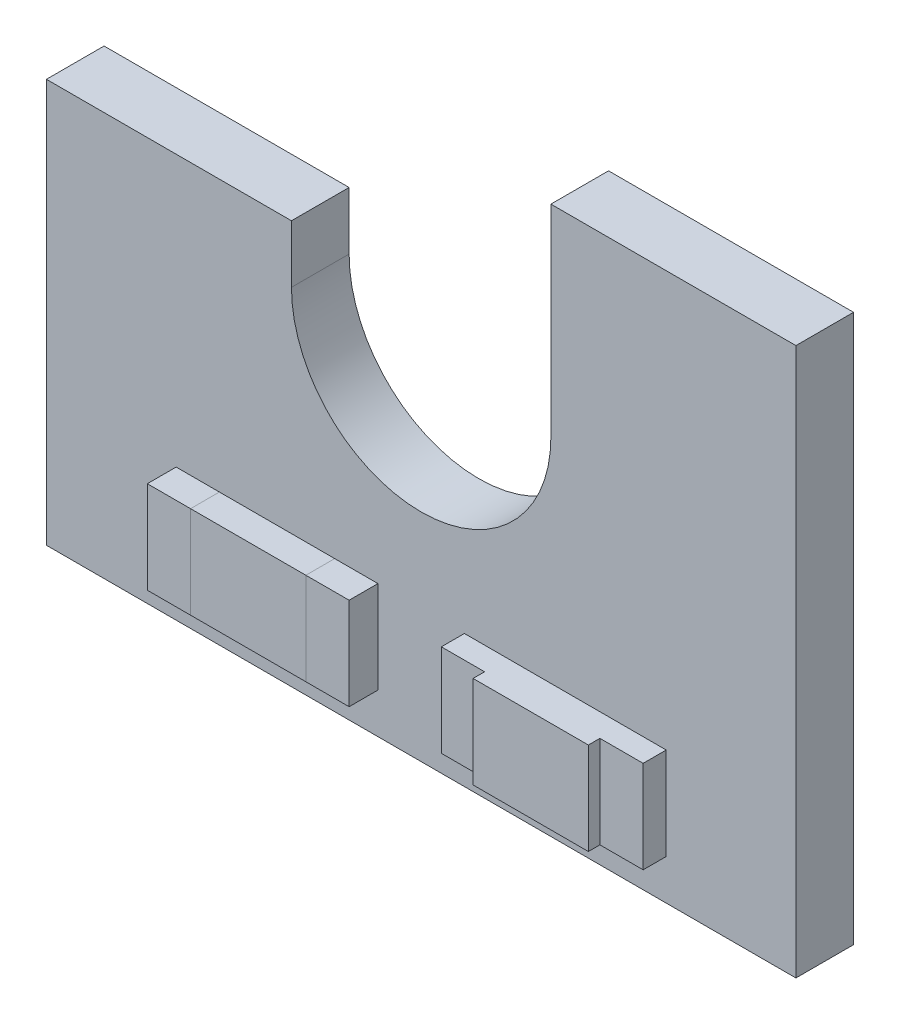
ISO-10303-21;
HEADER;
FILE_DESCRIPTION(('STEP AP214'),'2;1');
FILE_NAME('part.step','',(''),(''),'','','');
FILE_SCHEMA(('AUTOMOTIVE_DESIGN { 1 0 10303 214 1 1 1 1 }'));
ENDSEC;
DATA;
#1=APPLICATION_CONTEXT('core data for automotive mechanical design processes');
#2=APPLICATION_PROTOCOL_DEFINITION('international standard','automotive_design',2000,#1);
#3=PRODUCT_CONTEXT('',#1,'mechanical');
#4=PRODUCT('Part','Part','',(#3));
#5=PRODUCT_RELATED_PRODUCT_CATEGORY('part','',(#4));
#6=PRODUCT_DEFINITION_FORMATION('','',#4);
#7=PRODUCT_DEFINITION_CONTEXT('part definition',#1,'design');
#8=PRODUCT_DEFINITION('design','',#6,#7);
#9=PRODUCT_DEFINITION_SHAPE('','',#8);
#10=(LENGTH_UNIT() NAMED_UNIT(*) SI_UNIT(.MILLI.,.METRE.));
#11=(NAMED_UNIT(*) PLANE_ANGLE_UNIT() SI_UNIT($,.RADIAN.));
#12=(NAMED_UNIT(*) SI_UNIT($,.STERADIAN.) SOLID_ANGLE_UNIT());
#13=UNCERTAINTY_MEASURE_WITH_UNIT(LENGTH_MEASURE(1.E-05),#10,'distance_accuracy_value','');
#14=(GEOMETRIC_REPRESENTATION_CONTEXT(3) GLOBAL_UNCERTAINTY_ASSIGNED_CONTEXT((#13)) GLOBAL_UNIT_ASSIGNED_CONTEXT((#10,
#11,#12)) REPRESENTATION_CONTEXT('',''));
#15=CARTESIAN_POINT('',(0.,0.,0.));
#16=DIRECTION('',(0.,0.,1.));
#17=DIRECTION('',(1.,0.,0.));
#18=AXIS2_PLACEMENT_3D('',#15,#16,#17);
#19=CARTESIAN_POINT('',(0.,0.,0.4));
#20=DIRECTION('',(0.,0.,1.));
#21=DIRECTION('',(1.,0.,0.));
#22=AXIS2_PLACEMENT_3D('',#19,#20,#21);
#23=PLANE('',#22);
#24=DIRECTION('',(0.,1.,0.));
#25=VECTOR('',#24,1.);
#26=CARTESIAN_POINT('',(3.5,-2.45,0.4));
#27=LINE('',#26,#25);
#28=CARTESIAN_POINT('',(3.5,-4.05,0.4));
#29=VERTEX_POINT('',#28);
#30=CARTESIAN_POINT('',(3.5,-2.45,0.4));
#31=VERTEX_POINT('',#30);
#32=EDGE_CURVE('E59',#29,#31,#27,.T.);
#33=ORIENTED_EDGE('',*,*,#32,.F.);
#34=DIRECTION('',(1.,0.,0.));
#35=VECTOR('',#34,1.);
#36=CARTESIAN_POINT('',(0.750000000000001,-4.05,0.4));
#37=LINE('',#36,#35);
#38=CARTESIAN_POINT('',(4.25,-4.05,0.4));
#39=VERTEX_POINT('',#38);
#40=EDGE_CURVE('E148',#29,#39,#37,.T.);
#41=ORIENTED_EDGE('',*,*,#40,.T.);
#42=DIRECTION('',(0.,1.,0.));
#43=VECTOR('',#42,1.);
#44=CARTESIAN_POINT('',(4.25,-2.45,0.4));
#45=LINE('',#44,#43);
#46=CARTESIAN_POINT('',(4.25,-2.45,0.4));
#47=VERTEX_POINT('',#46);
#48=EDGE_CURVE('E139',#39,#47,#45,.T.);
#49=ORIENTED_EDGE('',*,*,#48,.T.);
#50=DIRECTION('',(-1.,0.,0.));
#51=VECTOR('',#50,1.);
#52=CARTESIAN_POINT('',(0.750000000000001,-2.45,0.4));
#53=LINE('',#52,#51);
#54=EDGE_CURVE('E144',#47,#31,#53,.T.);
#55=ORIENTED_EDGE('',*,*,#54,.T.);
#56=EDGE_LOOP('',(#33,#41,#49,#55));
#57=FACE_BOUND('',#56,.T.);
#58=ADVANCED_FACE('F44',(#57),#23,.T.);
#59=CARTESIAN_POINT('',(4.25,-2.45,0.4));
#60=DIRECTION('',(-1.,0.,0.));
#61=DIRECTION('',(0.,0.,1.));
#62=AXIS2_PLACEMENT_3D('',#59,#60,#61);
#63=PLANE('',#62);
#64=DIRECTION('',(0.,1.,0.));
#65=VECTOR('',#64,1.);
#66=CARTESIAN_POINT('',(4.25,-2.45,0.));
#67=LINE('',#66,#65);
#68=CARTESIAN_POINT('',(4.25,-4.05,0.));
#69=VERTEX_POINT('',#68);
#70=CARTESIAN_POINT('',(4.25,-2.45,0.));
#71=VERTEX_POINT('',#70);
#72=EDGE_CURVE('E130',#69,#71,#67,.T.);
#73=ORIENTED_EDGE('',*,*,#72,.T.);
#74=DIRECTION('',(0.,0.,-1.));
#75=VECTOR('',#74,1.);
#76=CARTESIAN_POINT('',(4.25,-2.45,0.4));
#77=LINE('',#76,#75);
#78=EDGE_CURVE('E12',#47,#71,#77,.T.);
#79=ORIENTED_EDGE('',*,*,#78,.F.);
#80=ORIENTED_EDGE('',*,*,#48,.F.);
#81=DIRECTION('',(0.,0.,-1.));
#82=VECTOR('',#81,1.);
#83=CARTESIAN_POINT('',(4.25,-4.05,0.4));
#84=LINE('',#83,#82);
#85=EDGE_CURVE('E150',#39,#69,#84,.T.);
#86=ORIENTED_EDGE('',*,*,#85,.T.);
#87=EDGE_LOOP('',(#73,#79,#80,#86));
#88=FACE_BOUND('',#87,.T.);
#89=ADVANCED_FACE('F46',(#88),#63,.F.);
#90=CARTESIAN_POINT('',(0.750000000000001,-2.45,0.4));
#91=DIRECTION('',(0.,-1.,0.));
#92=DIRECTION('',(0.,0.,-1.));
#93=AXIS2_PLACEMENT_3D('',#90,#91,#92);
#94=PLANE('',#93);
#95=DIRECTION('',(-1.,0.,0.));
#96=VECTOR('',#95,1.);
#97=CARTESIAN_POINT('',(0.750000000000001,-2.45,0.));
#98=LINE('',#97,#96);
#99=CARTESIAN_POINT('',(0.750000000000001,-2.45,0.));
#100=VERTEX_POINT('',#99);
#101=EDGE_CURVE('E133',#71,#100,#98,.T.);
#102=ORIENTED_EDGE('',*,*,#101,.T.);
#103=DIRECTION('',(0.,0.,-1.));
#104=VECTOR('',#103,1.);
#105=CARTESIAN_POINT('',(0.750000000000001,-2.45,0.4));
#106=LINE('',#105,#104);
#107=CARTESIAN_POINT('',(0.750000000000001,-2.45,0.4));
#108=VERTEX_POINT('',#107);
#109=EDGE_CURVE('E52',#108,#100,#106,.T.);
#110=ORIENTED_EDGE('',*,*,#109,.F.);
#111=CARTESIAN_POINT('',(1.5,-2.45,0.4));
#112=VERTEX_POINT('',#111);
#113=EDGE_CURVE('E142',#112,#108,#53,.T.);
#114=ORIENTED_EDGE('',*,*,#113,.F.);
#115=DIRECTION('',(0.,0.,-1.));
#116=VECTOR('',#115,1.);
#117=CARTESIAN_POINT('',(1.5,-2.45,0.6));
#118=LINE('',#117,#116);
#119=CARTESIAN_POINT('',(1.5,-2.45,0.6));
#120=VERTEX_POINT('',#119);
#121=EDGE_CURVE('E115',#120,#112,#118,.T.);
#122=ORIENTED_EDGE('',*,*,#121,.F.);
#123=DIRECTION('',(-1.,0.,0.));
#124=VECTOR('',#123,1.);
#125=CARTESIAN_POINT('',(1.5,-2.45,0.6));
#126=LINE('',#125,#124);
#127=CARTESIAN_POINT('',(3.5,-2.45,0.6));
#128=VERTEX_POINT('',#127);
#129=EDGE_CURVE('E109',#128,#120,#126,.T.);
#130=ORIENTED_EDGE('',*,*,#129,.F.);
#131=DIRECTION('',(0.,0.,-1.));
#132=VECTOR('',#131,1.);
#133=CARTESIAN_POINT('',(3.5,-2.45,0.6));
#134=LINE('',#133,#132);
#135=EDGE_CURVE('E113',#128,#31,#134,.T.);
#136=ORIENTED_EDGE('',*,*,#135,.T.);
#137=ORIENTED_EDGE('',*,*,#54,.F.);
#138=ORIENTED_EDGE('',*,*,#78,.T.);
#139=EDGE_LOOP('',(#102,#110,#114,#122,#130,#136,#137,#138));
#140=FACE_BOUND('',#139,.T.);
#141=ADVANCED_FACE('F111',(#140),#94,.F.);
#142=CARTESIAN_POINT('',(0.750000000000001,-2.45,0.4));
#143=DIRECTION('',(1.,0.,0.));
#144=DIRECTION('',(0.,1.,0.));
#145=AXIS2_PLACEMENT_3D('',#142,#143,#144);
#146=PLANE('',#145);
#147=DIRECTION('',(0.,-1.,0.));
#148=VECTOR('',#147,1.);
#149=CARTESIAN_POINT('',(0.750000000000001,-2.45,0.));
#150=LINE('',#149,#148);
#151=CARTESIAN_POINT('',(0.750000000000001,-4.05,0.));
#152=VERTEX_POINT('',#151);
#153=EDGE_CURVE('E153',#100,#152,#150,.T.);
#154=ORIENTED_EDGE('',*,*,#153,.T.);
#155=DIRECTION('',(0.,0.,-1.));
#156=VECTOR('',#155,1.);
#157=CARTESIAN_POINT('',(0.750000000000001,-4.05,0.4));
#158=LINE('',#157,#156);
#159=CARTESIAN_POINT('',(0.750000000000001,-4.05,0.4));
#160=VERTEX_POINT('',#159);
#161=EDGE_CURVE('E158',#160,#152,#158,.T.);
#162=ORIENTED_EDGE('',*,*,#161,.F.);
#163=DIRECTION('',(0.,-1.,0.));
#164=VECTOR('',#163,1.);
#165=CARTESIAN_POINT('',(0.750000000000001,-2.45,0.4));
#166=LINE('',#165,#164);
#167=EDGE_CURVE('E146',#108,#160,#166,.T.);
#168=ORIENTED_EDGE('',*,*,#167,.F.);
#169=ORIENTED_EDGE('',*,*,#109,.T.);
#170=EDGE_LOOP('',(#154,#162,#168,#169));
#171=FACE_BOUND('',#170,.T.);
#172=ADVANCED_FACE('F165',(#171),#146,.F.);
#173=CARTESIAN_POINT('',(0.750000000000001,-4.05,0.4));
#174=DIRECTION('',(0.,1.,0.));
#175=DIRECTION('',(0.,0.,1.));
#176=AXIS2_PLACEMENT_3D('',#173,#174,#175);
#177=PLANE('',#176);
#178=DIRECTION('',(1.,0.,0.));
#179=VECTOR('',#178,1.);
#180=CARTESIAN_POINT('',(0.750000000000001,-4.05,0.));
#181=LINE('',#180,#179);
#182=EDGE_CURVE('E143',#152,#69,#181,.T.);
#183=ORIENTED_EDGE('',*,*,#182,.T.);
#184=ORIENTED_EDGE('',*,*,#85,.F.);
#185=ORIENTED_EDGE('',*,*,#40,.F.);
#186=DIRECTION('',(0.,0.,-1.));
#187=VECTOR('',#186,1.);
#188=CARTESIAN_POINT('',(3.5,-4.05,0.6));
#189=LINE('',#188,#187);
#190=CARTESIAN_POINT('',(3.5,-4.05,0.6));
#191=VERTEX_POINT('',#190);
#192=EDGE_CURVE('E178',#191,#29,#189,.T.);
#193=ORIENTED_EDGE('',*,*,#192,.F.);
#194=DIRECTION('',(1.,0.,0.));
#195=VECTOR('',#194,1.);
#196=CARTESIAN_POINT('',(1.5,-4.05,0.6));
#197=LINE('',#196,#195);
#198=CARTESIAN_POINT('',(1.5,-4.05,0.6));
#199=VERTEX_POINT('',#198);
#200=EDGE_CURVE('E124',#199,#191,#197,.T.);
#201=ORIENTED_EDGE('',*,*,#200,.F.);
#202=DIRECTION('',(0.,0.,-1.));
#203=VECTOR('',#202,1.);
#204=CARTESIAN_POINT('',(1.5,-4.05,0.6));
#205=LINE('',#204,#203);
#206=CARTESIAN_POINT('',(1.5,-4.05,0.4));
#207=VERTEX_POINT('',#206);
#208=EDGE_CURVE('E135',#199,#207,#205,.T.);
#209=ORIENTED_EDGE('',*,*,#208,.T.);
#210=EDGE_CURVE('E149',#160,#207,#37,.T.);
#211=ORIENTED_EDGE('',*,*,#210,.F.);
#212=ORIENTED_EDGE('',*,*,#161,.T.);
#213=EDGE_LOOP('',(#183,#184,#185,#193,#201,#209,#211,#212));
#214=FACE_BOUND('',#213,.T.);
#215=ADVANCED_FACE('F173',(#214),#177,.F.);
#216=DIRECTION('',(0.,-1.,0.));
#217=VECTOR('',#216,1.);
#218=CARTESIAN_POINT('',(1.5,-2.45,0.4));
#219=LINE('',#218,#217);
#220=EDGE_CURVE('E67',#112,#207,#219,.T.);
#221=ORIENTED_EDGE('',*,*,#220,.F.);
#222=ORIENTED_EDGE('',*,*,#113,.T.);
#223=ORIENTED_EDGE('',*,*,#167,.T.);
#224=ORIENTED_EDGE('',*,*,#210,.T.);
#225=EDGE_LOOP('',(#221,#222,#223,#224));
#226=FACE_BOUND('',#225,.T.);
#227=ADVANCED_FACE('F188',(#226),#23,.T.);
#228=CARTESIAN_POINT('',(0.,0.,0.));
#229=DIRECTION('',(0.,0.,1.));
#230=DIRECTION('',(1.,0.,0.));
#231=AXIS2_PLACEMENT_3D('',#228,#229,#230);
#232=PLANE('',#231);
#233=ORIENTED_EDGE('',*,*,#72,.F.);
#234=ORIENTED_EDGE('',*,*,#182,.F.);
#235=ORIENTED_EDGE('',*,*,#153,.F.);
#236=ORIENTED_EDGE('',*,*,#101,.F.);
#237=EDGE_LOOP('',(#233,#234,#235,#236));
#238=FACE_BOUND('',#237,.T.);
#239=ADVANCED_FACE('F170',(#238),#232,.F.);
#240=CARTESIAN_POINT('',(3.5,-2.45,0.6));
#241=DIRECTION('',(-1.,0.,0.));
#242=DIRECTION('',(0.,0.,1.));
#243=AXIS2_PLACEMENT_3D('',#240,#241,#242);
#244=PLANE('',#243);
#245=ORIENTED_EDGE('',*,*,#32,.T.);
#246=ORIENTED_EDGE('',*,*,#135,.F.);
#247=DIRECTION('',(0.,1.,0.));
#248=VECTOR('',#247,1.);
#249=CARTESIAN_POINT('',(3.5,-2.45,0.6));
#250=LINE('',#249,#248);
#251=EDGE_CURVE('E119',#191,#128,#250,.T.);
#252=ORIENTED_EDGE('',*,*,#251,.F.);
#253=ORIENTED_EDGE('',*,*,#192,.T.);
#254=EDGE_LOOP('',(#245,#246,#252,#253));
#255=FACE_BOUND('',#254,.T.);
#256=ADVANCED_FACE('F129',(#255),#244,.F.);
#257=CARTESIAN_POINT('',(1.5,-2.45,0.6));
#258=DIRECTION('',(1.,0.,0.));
#259=DIRECTION('',(0.,0.,-1.));
#260=AXIS2_PLACEMENT_3D('',#257,#258,#259);
#261=PLANE('',#260);
#262=ORIENTED_EDGE('',*,*,#220,.T.);
#263=ORIENTED_EDGE('',*,*,#208,.F.);
#264=DIRECTION('',(0.,-1.,0.));
#265=VECTOR('',#264,1.);
#266=CARTESIAN_POINT('',(1.5,-2.45,0.6));
#267=LINE('',#266,#265);
#268=EDGE_CURVE('E118',#120,#199,#267,.T.);
#269=ORIENTED_EDGE('',*,*,#268,.F.);
#270=ORIENTED_EDGE('',*,*,#121,.T.);
#271=EDGE_LOOP('',(#262,#263,#269,#270));
#272=FACE_BOUND('',#271,.T.);
#273=ADVANCED_FACE('F187',(#272),#261,.F.);
#274=CARTESIAN_POINT('',(0.,0.,0.6));
#275=DIRECTION('',(0.,0.,1.));
#276=DIRECTION('',(1.,0.,0.));
#277=AXIS2_PLACEMENT_3D('',#274,#275,#276);
#278=PLANE('',#277);
#279=ORIENTED_EDGE('',*,*,#251,.T.);
#280=ORIENTED_EDGE('',*,*,#129,.T.);
#281=ORIENTED_EDGE('',*,*,#268,.T.);
#282=ORIENTED_EDGE('',*,*,#200,.T.);
#283=EDGE_LOOP('',(#279,#280,#281,#282));
#284=FACE_BOUND('',#283,.T.);
#285=ADVANCED_FACE('F122',(#284),#278,.T.);
#286=CLOSED_SHELL('',(#58,#89,#141,#172,#215,#227,#239,#256,#273,#285));
#287=MANIFOLD_SOLID_BREP('B2',#286);
#288=CARTESIAN_POINT('',(-0.750000000000002,-2.45,0.5));
#289=DIRECTION('',(0.,1.,0.));
#290=DIRECTION('',(0.,0.,1.));
#291=AXIS2_PLACEMENT_3D('',#288,#289,#290);
#292=PLANE('',#291);
#293=DIRECTION('',(0.,0.,-1.));
#294=VECTOR('',#293,1.);
#295=CARTESIAN_POINT('',(-1.5,-2.45,0.5));
#296=LINE('',#295,#294);
#297=CARTESIAN_POINT('',(-1.5,-2.45,0.5));
#298=VERTEX_POINT('',#297);
#299=CARTESIAN_POINT('',(-1.5,-2.45,0.));
#300=VERTEX_POINT('',#299);
#301=EDGE_CURVE('E349',#298,#300,#296,.T.);
#302=ORIENTED_EDGE('',*,*,#301,.F.);
#303=DIRECTION('',(-1.,0.,0.));
#304=VECTOR('',#303,1.);
#305=CARTESIAN_POINT('',(-0.750000000000002,-2.45,0.5));
#306=LINE('',#305,#304);
#307=CARTESIAN_POINT('',(-0.750000000000002,-2.45,0.5));
#308=VERTEX_POINT('',#307);
#309=EDGE_CURVE('E42',#308,#298,#306,.T.);
#310=ORIENTED_EDGE('',*,*,#309,.F.);
#311=DIRECTION('',(0.,0.,-1.));
#312=VECTOR('',#311,1.);
#313=CARTESIAN_POINT('',(-0.750000000000002,-2.45,0.5));
#314=LINE('',#313,#312);
#315=CARTESIAN_POINT('',(-0.750000000000002,-2.45,0.));
#316=VERTEX_POINT('',#315);
#317=EDGE_CURVE('E343',#308,#316,#314,.T.);
#318=ORIENTED_EDGE('',*,*,#317,.T.);
#319=DIRECTION('',(-1.,0.,0.));
#320=VECTOR('',#319,1.);
#321=CARTESIAN_POINT('',(-0.750000000000002,-2.45,0.));
#322=LINE('',#321,#320);
#323=EDGE_CURVE('E288',#316,#300,#322,.T.);
#324=ORIENTED_EDGE('',*,*,#323,.T.);
#325=EDGE_LOOP('',(#302,#310,#318,#324));
#326=FACE_BOUND('',#325,.T.);
#327=ADVANCED_FACE('F285',(#326),#292,.T.);
#328=CARTESIAN_POINT('',(-0.750000000000002,-4.05,0.5));
#329=DIRECTION('',(0.,0.,1.));
#330=DIRECTION('',(1.,0.,0.));
#331=AXIS2_PLACEMENT_3D('',#328,#329,#330);
#332=PLANE('',#331);
#333=DIRECTION('',(0.,1.,0.));
#334=VECTOR('',#333,1.);
#335=CARTESIAN_POINT('',(-1.5,-4.05,0.5));
#336=LINE('',#335,#334);
#337=CARTESIAN_POINT('',(-1.5,-4.05,0.5));
#338=VERTEX_POINT('',#337);
#339=EDGE_CURVE('E345',#338,#298,#336,.T.);
#340=ORIENTED_EDGE('',*,*,#339,.F.);
#341=DIRECTION('',(-1.,0.,0.));
#342=VECTOR('',#341,1.);
#343=CARTESIAN_POINT('',(-0.750000000000002,-4.05,0.5));
#344=LINE('',#343,#342);
#345=CARTESIAN_POINT('',(-0.750000000000002,-4.05,0.5));
#346=VERTEX_POINT('',#345);
#347=EDGE_CURVE('E294',#346,#338,#344,.T.);
#348=ORIENTED_EDGE('',*,*,#347,.F.);
#349=DIRECTION('',(0.,1.,0.));
#350=VECTOR('',#349,1.);
#351=CARTESIAN_POINT('',(-0.750000000000002,-4.05,0.5));
#352=LINE('',#351,#350);
#353=EDGE_CURVE('E340',#346,#308,#352,.T.);
#354=ORIENTED_EDGE('',*,*,#353,.T.);
#355=ORIENTED_EDGE('',*,*,#309,.T.);
#356=EDGE_LOOP('',(#340,#348,#354,#355));
#357=FACE_BOUND('',#356,.T.);
#358=ADVANCED_FACE('F359',(#357),#332,.T.);
#359=CARTESIAN_POINT('',(-0.750000000000002,-4.05,0.));
#360=DIRECTION('',(0.,-1.,0.));
#361=DIRECTION('',(0.,0.,-1.));
#362=AXIS2_PLACEMENT_3D('',#359,#360,#361);
#363=PLANE('',#362);
#364=DIRECTION('',(0.,0.,1.));
#365=VECTOR('',#364,1.);
#366=CARTESIAN_POINT('',(-1.5,-4.05,0.));
#367=LINE('',#366,#365);
#368=CARTESIAN_POINT('',(-1.5,-4.05,0.));
#369=VERTEX_POINT('',#368);
#370=EDGE_CURVE('E335',#369,#338,#367,.T.);
#371=ORIENTED_EDGE('',*,*,#370,.F.);
#372=DIRECTION('',(-1.,0.,0.));
#373=VECTOR('',#372,1.);
#374=CARTESIAN_POINT('',(-0.750000000000002,-4.05,0.));
#375=LINE('',#374,#373);
#376=CARTESIAN_POINT('',(-0.750000000000002,-4.05,0.));
#377=VERTEX_POINT('',#376);
#378=EDGE_CURVE('E330',#377,#369,#375,.T.);
#379=ORIENTED_EDGE('',*,*,#378,.F.);
#380=DIRECTION('',(0.,0.,1.));
#381=VECTOR('',#380,1.);
#382=CARTESIAN_POINT('',(-0.750000000000002,-4.05,0.));
#383=LINE('',#382,#381);
#384=EDGE_CURVE('E333',#377,#346,#383,.T.);
#385=ORIENTED_EDGE('',*,*,#384,.T.);
#386=ORIENTED_EDGE('',*,*,#347,.T.);
#387=EDGE_LOOP('',(#371,#379,#385,#386));
#388=FACE_BOUND('',#387,.T.);
#389=ADVANCED_FACE('F332',(#388),#363,.T.);
#390=CARTESIAN_POINT('',(-0.750000000000002,-2.45,0.));
#391=DIRECTION('',(0.,0.,-1.));
#392=DIRECTION('',(-1.,0.,0.));
#393=AXIS2_PLACEMENT_3D('',#390,#391,#392);
#394=PLANE('',#393);
#395=DIRECTION('',(0.,-1.,0.));
#396=VECTOR('',#395,1.);
#397=CARTESIAN_POINT('',(-1.5,-2.45,0.));
#398=LINE('',#397,#396);
#399=EDGE_CURVE('E352',#300,#369,#398,.T.);
#400=ORIENTED_EDGE('',*,*,#399,.F.);
#401=ORIENTED_EDGE('',*,*,#323,.F.);
#402=DIRECTION('',(0.,-1.,0.));
#403=VECTOR('',#402,1.);
#404=CARTESIAN_POINT('',(-0.750000000000002,-2.45,0.));
#405=LINE('',#404,#403);
#406=EDGE_CURVE('E339',#316,#377,#405,.T.);
#407=ORIENTED_EDGE('',*,*,#406,.T.);
#408=ORIENTED_EDGE('',*,*,#378,.T.);
#409=EDGE_LOOP('',(#400,#401,#407,#408));
#410=FACE_BOUND('',#409,.T.);
#411=ADVANCED_FACE('F342',(#410),#394,.T.);
#412=CARTESIAN_POINT('',(-0.750000000000003,0.,0.));
#413=DIRECTION('',(-1.,0.,0.));
#414=DIRECTION('',(0.,-1.,0.));
#415=AXIS2_PLACEMENT_3D('',#412,#413,#414);
#416=PLANE('',#415);
#417=ORIENTED_EDGE('',*,*,#317,.F.);
#418=ORIENTED_EDGE('',*,*,#353,.F.);
#419=ORIENTED_EDGE('',*,*,#384,.F.);
#420=ORIENTED_EDGE('',*,*,#406,.F.);
#421=EDGE_LOOP('',(#417,#418,#419,#420));
#422=FACE_BOUND('',#421,.T.);
#423=ADVANCED_FACE('F338',(#422),#416,.F.);
#424=CARTESIAN_POINT('',(-1.5,0.,0.));
#425=DIRECTION('',(-1.,0.,0.));
#426=DIRECTION('',(0.,-1.,0.));
#427=AXIS2_PLACEMENT_3D('',#424,#425,#426);
#428=PLANE('',#427);
#429=ORIENTED_EDGE('',*,*,#301,.T.);
#430=ORIENTED_EDGE('',*,*,#399,.T.);
#431=ORIENTED_EDGE('',*,*,#370,.T.);
#432=ORIENTED_EDGE('',*,*,#339,.T.);
#433=EDGE_LOOP('',(#429,#430,#431,#432));
#434=FACE_BOUND('',#433,.T.);
#435=ADVANCED_FACE('F358',(#434),#428,.T.);
#436=CLOSED_SHELL('',(#327,#358,#389,#411,#423,#435));
#437=MANIFOLD_SOLID_BREP('B6',#436);
#438=CARTESIAN_POINT('',(-4.25,-4.05,0.5));
#439=DIRECTION('',(0.,-1.,0.));
#440=DIRECTION('',(0.,0.,-1.));
#441=AXIS2_PLACEMENT_3D('',#438,#439,#440);
#442=PLANE('',#441);
#443=DIRECTION('',(0.,0.,-1.));
#444=VECTOR('',#443,1.);
#445=CARTESIAN_POINT('',(-3.5,-4.05,0.5));
#446=LINE('',#445,#444);
#447=CARTESIAN_POINT('',(-3.5,-4.05,0.5));
#448=VERTEX_POINT('',#447);
#449=CARTESIAN_POINT('',(-3.5,-4.05,0.));
#450=VERTEX_POINT('',#449);
#451=EDGE_CURVE('E483',#448,#450,#446,.T.);
#452=ORIENTED_EDGE('',*,*,#451,.F.);
#453=DIRECTION('',(1.,0.,0.));
#454=VECTOR('',#453,1.);
#455=CARTESIAN_POINT('',(-4.25,-4.05,0.5));
#456=LINE('',#455,#454);
#457=CARTESIAN_POINT('',(-4.25,-4.05,0.5));
#458=VERTEX_POINT('',#457);
#459=EDGE_CURVE('E283',#458,#448,#456,.T.);
#460=ORIENTED_EDGE('',*,*,#459,.F.);
#461=DIRECTION('',(0.,0.,-1.));
#462=VECTOR('',#461,1.);
#463=CARTESIAN_POINT('',(-4.25,-4.05,0.5));
#464=LINE('',#463,#462);
#465=CARTESIAN_POINT('',(-4.25,-4.05,0.));
#466=VERTEX_POINT('',#465);
#467=EDGE_CURVE('E477',#458,#466,#464,.T.);
#468=ORIENTED_EDGE('',*,*,#467,.T.);
#469=DIRECTION('',(1.,0.,0.));
#470=VECTOR('',#469,1.);
#471=CARTESIAN_POINT('',(-4.25,-4.05,0.));
#472=LINE('',#471,#470);
#473=EDGE_CURVE('E422',#466,#450,#472,.T.);
#474=ORIENTED_EDGE('',*,*,#473,.T.);
#475=EDGE_LOOP('',(#452,#460,#468,#474));
#476=FACE_BOUND('',#475,.T.);
#477=ADVANCED_FACE('F419',(#476),#442,.T.);
#478=CARTESIAN_POINT('',(-4.25,-2.45,0.5));
#479=DIRECTION('',(0.,0.,1.));
#480=DIRECTION('',(1.,0.,0.));
#481=AXIS2_PLACEMENT_3D('',#478,#479,#480);
#482=PLANE('',#481);
#483=DIRECTION('',(0.,-1.,0.));
#484=VECTOR('',#483,1.);
#485=CARTESIAN_POINT('',(-3.5,-2.45,0.5));
#486=LINE('',#485,#484);
#487=CARTESIAN_POINT('',(-3.5,-2.45,0.5));
#488=VERTEX_POINT('',#487);
#489=EDGE_CURVE('E479',#488,#448,#486,.T.);
#490=ORIENTED_EDGE('',*,*,#489,.F.);
#491=DIRECTION('',(1.,0.,0.));
#492=VECTOR('',#491,1.);
#493=CARTESIAN_POINT('',(-4.25,-2.45,0.5));
#494=LINE('',#493,#492);
#495=CARTESIAN_POINT('',(-4.25,-2.45,0.5));
#496=VERTEX_POINT('',#495);
#497=EDGE_CURVE('E428',#496,#488,#494,.T.);
#498=ORIENTED_EDGE('',*,*,#497,.F.);
#499=DIRECTION('',(0.,-1.,0.));
#500=VECTOR('',#499,1.);
#501=CARTESIAN_POINT('',(-4.25,-2.45,0.5));
#502=LINE('',#501,#500);
#503=EDGE_CURVE('E474',#496,#458,#502,.T.);
#504=ORIENTED_EDGE('',*,*,#503,.T.);
#505=ORIENTED_EDGE('',*,*,#459,.T.);
#506=EDGE_LOOP('',(#490,#498,#504,#505));
#507=FACE_BOUND('',#506,.T.);
#508=ADVANCED_FACE('F493',(#507),#482,.T.);
#509=CARTESIAN_POINT('',(-4.25,-2.45,0.));
#510=DIRECTION('',(0.,1.,0.));
#511=DIRECTION('',(0.,0.,1.));
#512=AXIS2_PLACEMENT_3D('',#509,#510,#511);
#513=PLANE('',#512);
#514=DIRECTION('',(0.,0.,1.));
#515=VECTOR('',#514,1.);
#516=CARTESIAN_POINT('',(-3.5,-2.45,0.));
#517=LINE('',#516,#515);
#518=CARTESIAN_POINT('',(-3.5,-2.45,0.));
#519=VERTEX_POINT('',#518);
#520=EDGE_CURVE('E469',#519,#488,#517,.T.);
#521=ORIENTED_EDGE('',*,*,#520,.F.);
#522=DIRECTION('',(1.,0.,0.));
#523=VECTOR('',#522,1.);
#524=CARTESIAN_POINT('',(-4.25,-2.45,0.));
#525=LINE('',#524,#523);
#526=CARTESIAN_POINT('',(-4.25,-2.45,0.));
#527=VERTEX_POINT('',#526);
#528=EDGE_CURVE('E464',#527,#519,#525,.T.);
#529=ORIENTED_EDGE('',*,*,#528,.F.);
#530=DIRECTION('',(0.,0.,1.));
#531=VECTOR('',#530,1.);
#532=CARTESIAN_POINT('',(-4.25,-2.45,0.));
#533=LINE('',#532,#531);
#534=EDGE_CURVE('E467',#527,#496,#533,.T.);
#535=ORIENTED_EDGE('',*,*,#534,.T.);
#536=ORIENTED_EDGE('',*,*,#497,.T.);
#537=EDGE_LOOP('',(#521,#529,#535,#536));
#538=FACE_BOUND('',#537,.T.);
#539=ADVANCED_FACE('F466',(#538),#513,.T.);
#540=CARTESIAN_POINT('',(-4.25,-4.05,0.));
#541=DIRECTION('',(0.,0.,-1.));
#542=DIRECTION('',(-1.,0.,0.));
#543=AXIS2_PLACEMENT_3D('',#540,#541,#542);
#544=PLANE('',#543);
#545=DIRECTION('',(0.,1.,0.));
#546=VECTOR('',#545,1.);
#547=CARTESIAN_POINT('',(-3.5,-4.05,0.));
#548=LINE('',#547,#546);
#549=EDGE_CURVE('E486',#450,#519,#548,.T.);
#550=ORIENTED_EDGE('',*,*,#549,.F.);
#551=ORIENTED_EDGE('',*,*,#473,.F.);
#552=DIRECTION('',(0.,1.,0.));
#553=VECTOR('',#552,1.);
#554=CARTESIAN_POINT('',(-4.25,-4.05,0.));
#555=LINE('',#554,#553);
#556=EDGE_CURVE('E473',#466,#527,#555,.T.);
#557=ORIENTED_EDGE('',*,*,#556,.T.);
#558=ORIENTED_EDGE('',*,*,#528,.T.);
#559=EDGE_LOOP('',(#550,#551,#557,#558));
#560=FACE_BOUND('',#559,.T.);
#561=ADVANCED_FACE('F476',(#560),#544,.T.);
#562=CARTESIAN_POINT('',(-4.25,0.,0.));
#563=DIRECTION('',(1.,0.,0.));
#564=DIRECTION('',(0.,0.,-1.));
#565=AXIS2_PLACEMENT_3D('',#562,#563,#564);
#566=PLANE('',#565);
#567=ORIENTED_EDGE('',*,*,#467,.F.);
#568=ORIENTED_EDGE('',*,*,#503,.F.);
#569=ORIENTED_EDGE('',*,*,#534,.F.);
#570=ORIENTED_EDGE('',*,*,#556,.F.);
#571=EDGE_LOOP('',(#567,#568,#569,#570));
#572=FACE_BOUND('',#571,.T.);
#573=ADVANCED_FACE('F472',(#572),#566,.F.);
#574=CARTESIAN_POINT('',(-3.5,0.,0.));
#575=DIRECTION('',(1.,0.,0.));
#576=DIRECTION('',(0.,0.,-1.));
#577=AXIS2_PLACEMENT_3D('',#574,#575,#576);
#578=PLANE('',#577);
#579=ORIENTED_EDGE('',*,*,#451,.T.);
#580=ORIENTED_EDGE('',*,*,#549,.T.);
#581=ORIENTED_EDGE('',*,*,#520,.T.);
#582=ORIENTED_EDGE('',*,*,#489,.T.);
#583=EDGE_LOOP('',(#579,#580,#581,#582));
#584=FACE_BOUND('',#583,.T.);
#585=ADVANCED_FACE('F492',(#584),#578,.T.);
#586=CLOSED_SHELL('',(#477,#508,#539,#561,#573,#585));
#587=MANIFOLD_SOLID_BREP('B36',#586);
#588=CARTESIAN_POINT('',(-1.5,-2.45,0.5));
#589=DIRECTION('',(-1.,0.,0.));
#590=DIRECTION('',(0.,-1.,0.));
#591=AXIS2_PLACEMENT_3D('',#588,#589,#590);
#592=PLANE('',#591);
#593=DIRECTION('',(0.,1.,0.));
#594=VECTOR('',#593,1.);
#595=CARTESIAN_POINT('',(-1.5,-2.45,0.));
#596=LINE('',#595,#594);
#597=CARTESIAN_POINT('',(-1.5,-4.05,0.));
#598=VERTEX_POINT('',#597);
#599=CARTESIAN_POINT('',(-1.5,-2.45,0.));
#600=VERTEX_POINT('',#599);
#601=EDGE_CURVE('E615',#598,#600,#596,.T.);
#602=ORIENTED_EDGE('',*,*,#601,.T.);
#603=DIRECTION('',(0.,0.,-1.));
#604=VECTOR('',#603,1.);
#605=CARTESIAN_POINT('',(-1.5,-2.45,0.5));
#606=LINE('',#605,#604);
#607=CARTESIAN_POINT('',(-1.5,-2.45,0.5));
#608=VERTEX_POINT('',#607);
#609=EDGE_CURVE('E417',#608,#600,#606,.T.);
#610=ORIENTED_EDGE('',*,*,#609,.F.);
#611=DIRECTION('',(0.,1.,0.));
#612=VECTOR('',#611,1.);
#613=CARTESIAN_POINT('',(-1.5,-2.45,0.5));
#614=LINE('',#613,#612);
#615=CARTESIAN_POINT('',(-1.5,-4.05,0.5));
#616=VERTEX_POINT('',#615);
#617=EDGE_CURVE('E603',#616,#608,#614,.T.);
#618=ORIENTED_EDGE('',*,*,#617,.F.);
#619=DIRECTION('',(0.,0.,-1.));
#620=VECTOR('',#619,1.);
#621=CARTESIAN_POINT('',(-1.5,-4.05,0.5));
#622=LINE('',#621,#620);
#623=EDGE_CURVE('E611',#616,#598,#622,.T.);
#624=ORIENTED_EDGE('',*,*,#623,.T.);
#625=EDGE_LOOP('',(#602,#610,#618,#624));
#626=FACE_BOUND('',#625,.T.);
#627=ADVANCED_FACE('F552',(#626),#592,.F.);
#628=CARTESIAN_POINT('',(-3.5,-2.45,0.5));
#629=DIRECTION('',(0.,-1.,0.));
#630=DIRECTION('',(0.,0.,-1.));
#631=AXIS2_PLACEMENT_3D('',#628,#629,#630);
#632=PLANE('',#631);
#633=DIRECTION('',(-1.,0.,0.));
#634=VECTOR('',#633,1.);
#635=CARTESIAN_POINT('',(-3.5,-2.45,0.));
#636=LINE('',#635,#634);
#637=CARTESIAN_POINT('',(-3.5,-2.45,0.));
#638=VERTEX_POINT('',#637);
#639=EDGE_CURVE('E607',#600,#638,#636,.T.);
#640=ORIENTED_EDGE('',*,*,#639,.T.);
#641=DIRECTION('',(0.,0.,-1.));
#642=VECTOR('',#641,1.);
#643=CARTESIAN_POINT('',(-3.5,-2.45,0.5));
#644=LINE('',#643,#642);
#645=CARTESIAN_POINT('',(-3.5,-2.45,0.5));
#646=VERTEX_POINT('',#645);
#647=EDGE_CURVE('E560',#646,#638,#644,.T.);
#648=ORIENTED_EDGE('',*,*,#647,.F.);
#649=DIRECTION('',(-1.,0.,0.));
#650=VECTOR('',#649,1.);
#651=CARTESIAN_POINT('',(-3.5,-2.45,0.5));
#652=LINE('',#651,#650);
#653=EDGE_CURVE('E598',#608,#646,#652,.T.);
#654=ORIENTED_EDGE('',*,*,#653,.F.);
#655=ORIENTED_EDGE('',*,*,#609,.T.);
#656=EDGE_LOOP('',(#640,#648,#654,#655));
#657=FACE_BOUND('',#656,.T.);
#658=ADVANCED_FACE('F606',(#657),#632,.F.);
#659=CARTESIAN_POINT('',(-3.5,-2.45,0.5));
#660=DIRECTION('',(1.,0.,0.));
#661=DIRECTION('',(0.,0.,-1.));
#662=AXIS2_PLACEMENT_3D('',#659,#660,#661);
#663=PLANE('',#662);
#664=DIRECTION('',(0.,-1.,0.));
#665=VECTOR('',#664,1.);
#666=CARTESIAN_POINT('',(-3.5,-2.45,0.));
#667=LINE('',#666,#665);
#668=CARTESIAN_POINT('',(-3.5,-4.05,0.));
#669=VERTEX_POINT('',#668);
#670=EDGE_CURVE('E585',#638,#669,#667,.T.);
#671=ORIENTED_EDGE('',*,*,#670,.T.);
#672=DIRECTION('',(0.,0.,-1.));
#673=VECTOR('',#672,1.);
#674=CARTESIAN_POINT('',(-3.5,-4.05,0.5));
#675=LINE('',#674,#673);
#676=CARTESIAN_POINT('',(-3.5,-4.05,0.5));
#677=VERTEX_POINT('',#676);
#678=EDGE_CURVE('E608',#677,#669,#675,.T.);
#679=ORIENTED_EDGE('',*,*,#678,.F.);
#680=DIRECTION('',(0.,-1.,0.));
#681=VECTOR('',#680,1.);
#682=CARTESIAN_POINT('',(-3.5,-2.45,0.5));
#683=LINE('',#682,#681);
#684=EDGE_CURVE('E601',#646,#677,#683,.T.);
#685=ORIENTED_EDGE('',*,*,#684,.F.);
#686=ORIENTED_EDGE('',*,*,#647,.T.);
#687=EDGE_LOOP('',(#671,#679,#685,#686));
#688=FACE_BOUND('',#687,.T.);
#689=ADVANCED_FACE('F609',(#688),#663,.F.);
#690=CARTESIAN_POINT('',(-3.5,-4.05,0.5));
#691=DIRECTION('',(0.,1.,0.));
#692=DIRECTION('',(0.,0.,1.));
#693=AXIS2_PLACEMENT_3D('',#690,#691,#692);
#694=PLANE('',#693);
#695=DIRECTION('',(1.,0.,0.));
#696=VECTOR('',#695,1.);
#697=CARTESIAN_POINT('',(-3.5,-4.05,0.));
#698=LINE('',#697,#696);
#699=EDGE_CURVE('E591',#669,#598,#698,.T.);
#700=ORIENTED_EDGE('',*,*,#699,.T.);
#701=ORIENTED_EDGE('',*,*,#623,.F.);
#702=DIRECTION('',(1.,0.,0.));
#703=VECTOR('',#702,1.);
#704=CARTESIAN_POINT('',(-3.5,-4.05,0.5));
#705=LINE('',#704,#703);
#706=EDGE_CURVE('E568',#677,#616,#705,.T.);
#707=ORIENTED_EDGE('',*,*,#706,.F.);
#708=ORIENTED_EDGE('',*,*,#678,.T.);
#709=EDGE_LOOP('',(#700,#701,#707,#708));
#710=FACE_BOUND('',#709,.T.);
#711=ADVANCED_FACE('F622',(#710),#694,.F.);
#712=CARTESIAN_POINT('',(0.,0.,0.5));
#713=DIRECTION('',(0.,0.,1.));
#714=DIRECTION('',(1.,0.,0.));
#715=AXIS2_PLACEMENT_3D('',#712,#713,#714);
#716=PLANE('',#715);
#717=ORIENTED_EDGE('',*,*,#617,.T.);
#718=ORIENTED_EDGE('',*,*,#653,.T.);
#719=ORIENTED_EDGE('',*,*,#684,.T.);
#720=ORIENTED_EDGE('',*,*,#706,.T.);
#721=EDGE_LOOP('',(#717,#718,#719,#720));
#722=FACE_BOUND('',#721,.T.);
#723=ADVANCED_FACE('F599',(#722),#716,.T.);
#724=CARTESIAN_POINT('',(0.,0.,0.));
#725=DIRECTION('',(0.,0.,1.));
#726=DIRECTION('',(1.,0.,0.));
#727=AXIS2_PLACEMENT_3D('',#724,#725,#726);
#728=PLANE('',#727);
#729=ORIENTED_EDGE('',*,*,#601,.F.);
#730=ORIENTED_EDGE('',*,*,#699,.F.);
#731=ORIENTED_EDGE('',*,*,#670,.F.);
#732=ORIENTED_EDGE('',*,*,#639,.F.);
#733=EDGE_LOOP('',(#729,#730,#731,#732));
#734=FACE_BOUND('',#733,.T.);
#735=ADVANCED_FACE('F625',(#734),#728,.F.);
#736=CLOSED_SHELL('',(#627,#658,#689,#711,#723,#735));
#737=MANIFOLD_SOLID_BREP('B277',#736);
#738=CARTESIAN_POINT('',(6.5,4.75,-1.));
#739=DIRECTION('',(1.,0.,0.));
#740=DIRECTION('',(0.,1.,0.));
#741=AXIS2_PLACEMENT_3D('',#738,#739,#740);
#742=PLANE('',#741);
#743=DIRECTION('',(0.,1.,0.));
#744=VECTOR('',#743,1.);
#745=CARTESIAN_POINT('',(6.5,4.75,0.));
#746=LINE('',#745,#744);
#747=CARTESIAN_POINT('',(6.5,-4.75,0.));
#748=VERTEX_POINT('',#747);
#749=CARTESIAN_POINT('',(6.5,4.75,0.));
#750=VERTEX_POINT('',#749);
#751=EDGE_CURVE('E770',#748,#750,#746,.T.);
#752=ORIENTED_EDGE('',*,*,#751,.F.);
#753=DIRECTION('',(0.,0.,1.));
#754=VECTOR('',#753,1.);
#755=CARTESIAN_POINT('',(6.5,-4.75,-1.));
#756=LINE('',#755,#754);
#757=CARTESIAN_POINT('',(6.5,-4.75,-1.));
#758=VERTEX_POINT('',#757);
#759=EDGE_CURVE('E550',#758,#748,#756,.T.);
#760=ORIENTED_EDGE('',*,*,#759,.F.);
#761=DIRECTION('',(0.,1.,0.));
#762=VECTOR('',#761,1.);
#763=CARTESIAN_POINT('',(6.5,4.75,-1.));
#764=LINE('',#763,#762);
#765=CARTESIAN_POINT('',(6.5,4.75,-1.));
#766=VERTEX_POINT('',#765);
#767=EDGE_CURVE('E766',#758,#766,#764,.T.);
#768=ORIENTED_EDGE('',*,*,#767,.T.);
#769=DIRECTION('',(0.,0.,1.));
#770=VECTOR('',#769,1.);
#771=CARTESIAN_POINT('',(6.5,4.75,-1.));
#772=LINE('',#771,#770);
#773=EDGE_CURVE('E679',#766,#750,#772,.T.);
#774=ORIENTED_EDGE('',*,*,#773,.T.);
#775=EDGE_LOOP('',(#752,#760,#768,#774));
#776=FACE_BOUND('',#775,.T.);
#777=ADVANCED_FACE('F676',(#776),#742,.T.);
#778=CARTESIAN_POINT('',(-6.5,-4.75,-1.));
#779=DIRECTION('',(0.,-1.,0.));
#780=DIRECTION('',(0.,0.,-1.));
#781=AXIS2_PLACEMENT_3D('',#778,#779,#780);
#782=PLANE('',#781);
#783=DIRECTION('',(1.,0.,0.));
#784=VECTOR('',#783,1.);
#785=CARTESIAN_POINT('',(-6.5,-4.75,0.));
#786=LINE('',#785,#784);
#787=CARTESIAN_POINT('',(-6.5,-4.75,0.));
#788=VERTEX_POINT('',#787);
#789=EDGE_CURVE('E778',#788,#748,#786,.T.);
#790=ORIENTED_EDGE('',*,*,#789,.F.);
#791=DIRECTION('',(0.,0.,1.));
#792=VECTOR('',#791,1.);
#793=CARTESIAN_POINT('',(-6.5,-4.75,-1.));
#794=LINE('',#793,#792);
#795=CARTESIAN_POINT('',(-6.5,-4.75,-1.));
#796=VERTEX_POINT('',#795);
#797=EDGE_CURVE('E684',#796,#788,#794,.T.);
#798=ORIENTED_EDGE('',*,*,#797,.F.);
#799=DIRECTION('',(1.,0.,0.));
#800=VECTOR('',#799,1.);
#801=CARTESIAN_POINT('',(-6.5,-4.75,-1.));
#802=LINE('',#801,#800);
#803=EDGE_CURVE('E761',#796,#758,#802,.T.);
#804=ORIENTED_EDGE('',*,*,#803,.T.);
#805=ORIENTED_EDGE('',*,*,#759,.T.);
#806=EDGE_LOOP('',(#790,#798,#804,#805));
#807=FACE_BOUND('',#806,.T.);
#808=ADVANCED_FACE('F793',(#807),#782,.T.);
#809=CARTESIAN_POINT('',(-6.5,4.75,-1.));
#810=DIRECTION('',(-1.,0.,0.));
#811=DIRECTION('',(0.,-1.,0.));
#812=AXIS2_PLACEMENT_3D('',#809,#810,#811);
#813=PLANE('',#812);
#814=DIRECTION('',(0.,0.,1.));
#815=VECTOR('',#814,1.);
#816=CARTESIAN_POINT('',(-6.5,2.25,-1.));
#817=LINE('',#816,#815);
#818=CARTESIAN_POINT('',(-6.5,2.25,-1.));
#819=VERTEX_POINT('',#818);
#820=CARTESIAN_POINT('',(-6.5,2.25,0.));
#821=VERTEX_POINT('',#820);
#822=EDGE_CURVE('E743',#819,#821,#817,.T.);
#823=ORIENTED_EDGE('',*,*,#822,.F.);
#824=DIRECTION('',(0.,-1.,0.));
#825=VECTOR('',#824,1.);
#826=CARTESIAN_POINT('',(-6.5,4.75,-1.));
#827=LINE('',#826,#825);
#828=EDGE_CURVE('E753',#819,#796,#827,.T.);
#829=ORIENTED_EDGE('',*,*,#828,.T.);
#830=ORIENTED_EDGE('',*,*,#797,.T.);
#831=DIRECTION('',(0.,-1.,0.));
#832=VECTOR('',#831,1.);
#833=CARTESIAN_POINT('',(-6.5,4.75,0.));
#834=LINE('',#833,#832);
#835=EDGE_CURVE('E755',#821,#788,#834,.T.);
#836=ORIENTED_EDGE('',*,*,#835,.F.);
#837=EDGE_LOOP('',(#823,#829,#830,#836));
#838=FACE_BOUND('',#837,.T.);
#839=ADVANCED_FACE('F751',(#838),#813,.T.);
#840=CARTESIAN_POINT('',(-6.5,4.75,-1.));
#841=DIRECTION('',(0.,1.,0.));
#842=DIRECTION('',(0.,0.,1.));
#843=AXIS2_PLACEMENT_3D('',#840,#841,#842);
#844=PLANE('',#843);
#845=DIRECTION('',(0.,0.,1.));
#846=VECTOR('',#845,1.);
#847=CARTESIAN_POINT('',(2.25,4.75,-1.));
#848=LINE('',#847,#846);
#849=CARTESIAN_POINT('',(2.25,4.75,-1.));
#850=VERTEX_POINT('',#849);
#851=CARTESIAN_POINT('',(2.25,4.75,0.));
#852=VERTEX_POINT('',#851);
#853=EDGE_CURVE('E774',#850,#852,#848,.T.);
#854=ORIENTED_EDGE('',*,*,#853,.T.);
#855=DIRECTION('',(-1.,0.,0.));
#856=VECTOR('',#855,1.);
#857=CARTESIAN_POINT('',(-6.5,4.75,0.));
#858=LINE('',#857,#856);
#859=EDGE_CURVE('E773',#750,#852,#858,.T.);
#860=ORIENTED_EDGE('',*,*,#859,.F.);
#861=ORIENTED_EDGE('',*,*,#773,.F.);
#862=DIRECTION('',(-1.,0.,0.));
#863=VECTOR('',#862,1.);
#864=CARTESIAN_POINT('',(-6.5,4.75,-1.));
#865=LINE('',#864,#863);
#866=EDGE_CURVE('E762',#766,#850,#865,.T.);
#867=ORIENTED_EDGE('',*,*,#866,.T.);
#868=EDGE_LOOP('',(#854,#860,#861,#867));
#869=FACE_BOUND('',#868,.T.);
#870=ADVANCED_FACE('F788',(#869),#844,.T.);
#871=CARTESIAN_POINT('',(0.,0.,-1.));
#872=DIRECTION('',(0.,0.,1.));
#873=DIRECTION('',(1.,0.,0.));
#874=AXIS2_PLACEMENT_3D('',#871,#872,#873);
#875=PLANE('',#874);
#876=ORIENTED_EDGE('',*,*,#828,.F.);
#877=DIRECTION('',(1.,0.,0.));
#878=VECTOR('',#877,1.);
#879=CARTESIAN_POINT('',(-2.25,2.25,-1.));
#880=LINE('',#879,#878);
#881=CARTESIAN_POINT('',(-2.25,2.25,-1.));
#882=VERTEX_POINT('',#881);
#883=EDGE_CURVE('E740',#819,#882,#880,.T.);
#884=ORIENTED_EDGE('',*,*,#883,.T.);
#885=DIRECTION('',(0.,-1.,0.));
#886=VECTOR('',#885,1.);
#887=CARTESIAN_POINT('',(-2.25,4.75,-1.));
#888=LINE('',#887,#886);
#889=CARTESIAN_POINT('',(-2.25,1.25,-1.));
#890=VERTEX_POINT('',#889);
#891=EDGE_CURVE('E804',#882,#890,#888,.T.);
#892=ORIENTED_EDGE('',*,*,#891,.T.);
#893=CARTESIAN_POINT('',(0.,1.25,-1.));
#894=DIRECTION('',(0.,0.,1.));
#895=DIRECTION('',(1.,0.,0.));
#896=AXIS2_PLACEMENT_3D('',#893,#894,#895);
#897=CIRCLE('',#896,2.25);
#898=CARTESIAN_POINT('',(2.25,1.25,-1.));
#899=VERTEX_POINT('',#898);
#900=EDGE_CURVE('E810',#890,#899,#897,.T.);
#901=ORIENTED_EDGE('',*,*,#900,.T.);
#902=DIRECTION('',(0.,1.,0.));
#903=VECTOR('',#902,1.);
#904=CARTESIAN_POINT('',(2.25,4.75,-1.));
#905=LINE('',#904,#903);
#906=EDGE_CURVE('E799',#899,#850,#905,.T.);
#907=ORIENTED_EDGE('',*,*,#906,.T.);
#908=ORIENTED_EDGE('',*,*,#866,.F.);
#909=ORIENTED_EDGE('',*,*,#767,.F.);
#910=ORIENTED_EDGE('',*,*,#803,.F.);
#911=EDGE_LOOP('',(#876,#884,#892,#901,#907,#908,#909,#910));
#912=FACE_BOUND('',#911,.T.);
#913=ADVANCED_FACE('F758',(#912),#875,.F.);
#914=CARTESIAN_POINT('',(0.,0.,0.));
#915=DIRECTION('',(0.,0.,1.));
#916=DIRECTION('',(1.,0.,0.));
#917=AXIS2_PLACEMENT_3D('',#914,#915,#916);
#918=PLANE('',#917);
#919=DIRECTION('',(1.,0.,0.));
#920=VECTOR('',#919,1.);
#921=CARTESIAN_POINT('',(-2.25,2.25,0.));
#922=LINE('',#921,#920);
#923=CARTESIAN_POINT('',(-2.25,2.25,0.));
#924=VERTEX_POINT('',#923);
#925=EDGE_CURVE('E692',#821,#924,#922,.T.);
#926=ORIENTED_EDGE('',*,*,#925,.F.);
#927=ORIENTED_EDGE('',*,*,#835,.T.);
#928=ORIENTED_EDGE('',*,*,#789,.T.);
#929=ORIENTED_EDGE('',*,*,#751,.T.);
#930=ORIENTED_EDGE('',*,*,#859,.T.);
#931=DIRECTION('',(0.,1.,0.));
#932=VECTOR('',#931,1.);
#933=CARTESIAN_POINT('',(2.25,4.75,0.));
#934=LINE('',#933,#932);
#935=CARTESIAN_POINT('',(2.25,1.25,0.));
#936=VERTEX_POINT('',#935);
#937=EDGE_CURVE('E802',#936,#852,#934,.T.);
#938=ORIENTED_EDGE('',*,*,#937,.F.);
#939=CARTESIAN_POINT('',(0.,1.25,0.));
#940=DIRECTION('',(0.,0.,1.));
#941=DIRECTION('',(1.,0.,0.));
#942=AXIS2_PLACEMENT_3D('',#939,#940,#941);
#943=CIRCLE('',#942,2.25);
#944=CARTESIAN_POINT('',(-2.25,1.25,0.));
#945=VERTEX_POINT('',#944);
#946=EDGE_CURVE('E805',#945,#936,#943,.T.);
#947=ORIENTED_EDGE('',*,*,#946,.F.);
#948=DIRECTION('',(0.,-1.,0.));
#949=VECTOR('',#948,1.);
#950=CARTESIAN_POINT('',(-2.25,4.75,0.));
#951=LINE('',#950,#949);
#952=EDGE_CURVE('E699',#924,#945,#951,.T.);
#953=ORIENTED_EDGE('',*,*,#952,.F.);
#954=EDGE_LOOP('',(#926,#927,#928,#929,#930,#938,#947,#953));
#955=FACE_BOUND('',#954,.T.);
#956=ADVANCED_FACE('F791',(#955),#918,.T.);
#957=CARTESIAN_POINT('',(-2.25,4.75,-1.));
#958=DIRECTION('',(-1.,0.,0.));
#959=DIRECTION('',(0.,-1.,0.));
#960=AXIS2_PLACEMENT_3D('',#957,#958,#959);
#961=PLANE('',#960);
#962=ORIENTED_EDGE('',*,*,#891,.F.);
#963=DIRECTION('',(0.,0.,1.));
#964=VECTOR('',#963,1.);
#965=CARTESIAN_POINT('',(-2.25,2.25,-1.));
#966=LINE('',#965,#964);
#967=EDGE_CURVE('E744',#882,#924,#966,.T.);
#968=ORIENTED_EDGE('',*,*,#967,.T.);
#969=ORIENTED_EDGE('',*,*,#952,.T.);
#970=DIRECTION('',(0.,0.,1.));
#971=VECTOR('',#970,1.);
#972=CARTESIAN_POINT('',(-2.25,1.25,-1.));
#973=LINE('',#972,#971);
#974=EDGE_CURVE('E796',#890,#945,#973,.T.);
#975=ORIENTED_EDGE('',*,*,#974,.F.);
#976=EDGE_LOOP('',(#962,#968,#969,#975));
#977=FACE_BOUND('',#976,.T.);
#978=ADVANCED_FACE('F815',(#977),#961,.F.);
#979=CARTESIAN_POINT('',(2.25,4.75,-1.));
#980=DIRECTION('',(1.,0.,0.));
#981=DIRECTION('',(0.,1.,0.));
#982=AXIS2_PLACEMENT_3D('',#979,#980,#981);
#983=PLANE('',#982);
#984=ORIENTED_EDGE('',*,*,#937,.T.);
#985=ORIENTED_EDGE('',*,*,#853,.F.);
#986=ORIENTED_EDGE('',*,*,#906,.F.);
#987=DIRECTION('',(0.,0.,1.));
#988=VECTOR('',#987,1.);
#989=CARTESIAN_POINT('',(2.25,1.25,-1.));
#990=LINE('',#989,#988);
#991=EDGE_CURVE('E798',#899,#936,#990,.T.);
#992=ORIENTED_EDGE('',*,*,#991,.T.);
#993=EDGE_LOOP('',(#984,#985,#986,#992));
#994=FACE_BOUND('',#993,.T.);
#995=ADVANCED_FACE('F822',(#994),#983,.F.);
#996=CARTESIAN_POINT('',(0.,1.25,-1.));
#997=DIRECTION('',(0.,0.,1.));
#998=DIRECTION('',(1.,0.,0.));
#999=AXIS2_PLACEMENT_3D('',#996,#997,#998);
#1000=CYLINDRICAL_SURFACE('',#999,2.25);
#1001=ORIENTED_EDGE('',*,*,#946,.T.);
#1002=ORIENTED_EDGE('',*,*,#991,.F.);
#1003=ORIENTED_EDGE('',*,*,#900,.F.);
#1004=ORIENTED_EDGE('',*,*,#974,.T.);
#1005=EDGE_LOOP('',(#1001,#1002,#1003,#1004));
#1006=FACE_BOUND('',#1005,.T.);
#1007=ADVANCED_FACE('F818',(#1006),#1000,.F.);
#1008=CARTESIAN_POINT('',(-2.25,2.25,-1.));
#1009=DIRECTION('',(0.,-1.,0.));
#1010=DIRECTION('',(1.,0.,0.));
#1011=AXIS2_PLACEMENT_3D('',#1008,#1009,#1010);
#1012=PLANE('',#1011);
#1013=ORIENTED_EDGE('',*,*,#925,.T.);
#1014=ORIENTED_EDGE('',*,*,#967,.F.);
#1015=ORIENTED_EDGE('',*,*,#883,.F.);
#1016=ORIENTED_EDGE('',*,*,#822,.T.);
#1017=EDGE_LOOP('',(#1013,#1014,#1015,#1016));
#1018=FACE_BOUND('',#1017,.T.);
#1019=ADVANCED_FACE('F742',(#1018),#1012,.F.);
#1020=CLOSED_SHELL('',(#777,#808,#839,#870,#913,#956,#978,#995,#1007,#1019));
#1021=MANIFOLD_SOLID_BREP('B411',#1020);
#1022=ADVANCED_BREP_SHAPE_REPRESENTATION('',(#18,#287,#437,#587,#737,#1021),#14);
#1023=SHAPE_DEFINITION_REPRESENTATION(#9,#1022);
ENDSEC;
END-ISO-10303-21;
